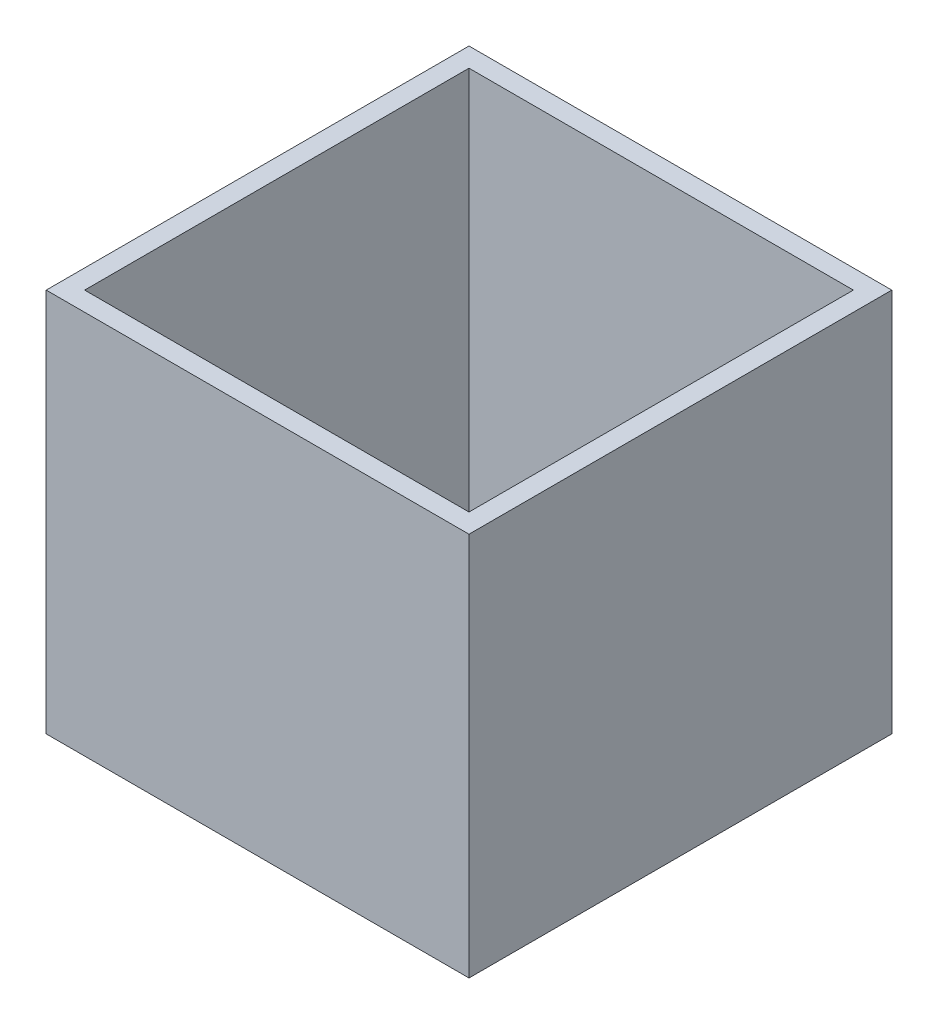
ISO-10303-21;
HEADER;
FILE_DESCRIPTION(('STEP AP214'),'2;1');
FILE_NAME('part.step','',(''),(''),'','','');
FILE_SCHEMA(('AUTOMOTIVE_DESIGN { 1 0 10303 214 1 1 1 1 }'));
ENDSEC;
DATA;
#1=APPLICATION_CONTEXT('core data for automotive mechanical design processes');
#2=APPLICATION_PROTOCOL_DEFINITION('international standard','automotive_design',2000,#1);
#3=PRODUCT_CONTEXT('',#1,'mechanical');
#4=PRODUCT('Part','Part','',(#3));
#5=PRODUCT_RELATED_PRODUCT_CATEGORY('part','',(#4));
#6=PRODUCT_DEFINITION_FORMATION('','',#4);
#7=PRODUCT_DEFINITION_CONTEXT('part definition',#1,'design');
#8=PRODUCT_DEFINITION('design','',#6,#7);
#9=PRODUCT_DEFINITION_SHAPE('','',#8);
#10=(LENGTH_UNIT() NAMED_UNIT(*) SI_UNIT(.MILLI.,.METRE.));
#11=(NAMED_UNIT(*) PLANE_ANGLE_UNIT() SI_UNIT($,.RADIAN.));
#12=(NAMED_UNIT(*) SI_UNIT($,.STERADIAN.) SOLID_ANGLE_UNIT());
#13=UNCERTAINTY_MEASURE_WITH_UNIT(LENGTH_MEASURE(1.E-05),#10,'distance_accuracy_value','');
#14=(GEOMETRIC_REPRESENTATION_CONTEXT(3) GLOBAL_UNCERTAINTY_ASSIGNED_CONTEXT((#13)) GLOBAL_UNIT_ASSIGNED_CONTEXT((#10,
#11,#12)) REPRESENTATION_CONTEXT('',''));
#15=CARTESIAN_POINT('',(0.,0.,0.));
#16=DIRECTION('',(0.,0.,1.));
#17=DIRECTION('',(1.,0.,0.));
#18=AXIS2_PLACEMENT_3D('',#15,#16,#17);
#19=CARTESIAN_POINT('',(41.91,76.2,-38.1));
#20=DIRECTION('',(-1.,0.,0.));
#21=DIRECTION('',(0.,0.,1.));
#22=AXIS2_PLACEMENT_3D('',#19,#20,#21);
#23=PLANE('',#22);
#24=DIRECTION('',(0.,0.,-1.));
#25=VECTOR('',#24,1.);
#26=CARTESIAN_POINT('',(41.91,0.,-38.1));
#27=LINE('',#26,#25);
#28=CARTESIAN_POINT('',(41.91,0.,41.91));
#29=VERTEX_POINT('',#28);
#30=CARTESIAN_POINT('',(41.91,0.,-41.91));
#31=VERTEX_POINT('',#30);
#32=EDGE_CURVE('E119',#29,#31,#27,.T.);
#33=ORIENTED_EDGE('',*,*,#32,.T.);
#34=DIRECTION('',(0.,-1.,0.));
#35=VECTOR('',#34,1.);
#36=CARTESIAN_POINT('',(41.91,76.2,-41.91));
#37=LINE('',#36,#35);
#38=CARTESIAN_POINT('',(41.91,76.2,-41.91));
#39=VERTEX_POINT('',#38);
#40=EDGE_CURVE('E11',#39,#31,#37,.T.);
#41=ORIENTED_EDGE('',*,*,#40,.F.);
#42=DIRECTION('',(0.,0.,-1.));
#43=VECTOR('',#42,1.);
#44=CARTESIAN_POINT('',(41.91,76.2,-38.1));
#45=LINE('',#44,#43);
#46=CARTESIAN_POINT('',(41.91,76.2,41.91));
#47=VERTEX_POINT('',#46);
#48=EDGE_CURVE('E153',#47,#39,#45,.T.);
#49=ORIENTED_EDGE('',*,*,#48,.F.);
#50=DIRECTION('',(0.,-1.,0.));
#51=VECTOR('',#50,1.);
#52=CARTESIAN_POINT('',(41.91,76.2,41.91));
#53=LINE('',#52,#51);
#54=EDGE_CURVE('E140',#47,#29,#53,.T.);
#55=ORIENTED_EDGE('',*,*,#54,.T.);
#56=EDGE_LOOP('',(#33,#41,#49,#55));
#57=FACE_BOUND('',#56,.T.);
#58=ADVANCED_FACE('F33',(#57),#23,.F.);
#59=CARTESIAN_POINT('',(-38.1,76.2,-41.91));
#60=DIRECTION('',(0.,0.,1.));
#61=DIRECTION('',(1.,0.,0.));
#62=AXIS2_PLACEMENT_3D('',#59,#60,#61);
#63=PLANE('',#62);
#64=DIRECTION('',(-1.,0.,0.));
#65=VECTOR('',#64,1.);
#66=CARTESIAN_POINT('',(-38.1,0.,-41.91));
#67=LINE('',#66,#65);
#68=CARTESIAN_POINT('',(-41.91,0.,-41.91));
#69=VERTEX_POINT('',#68);
#70=EDGE_CURVE('E150',#31,#69,#67,.T.);
#71=ORIENTED_EDGE('',*,*,#70,.T.);
#72=DIRECTION('',(0.,-1.,0.));
#73=VECTOR('',#72,1.);
#74=CARTESIAN_POINT('',(-41.91,76.2,-41.91));
#75=LINE('',#74,#73);
#76=CARTESIAN_POINT('',(-41.91,76.2,-41.91));
#77=VERTEX_POINT('',#76);
#78=EDGE_CURVE('E42',#77,#69,#75,.T.);
#79=ORIENTED_EDGE('',*,*,#78,.F.);
#80=DIRECTION('',(-1.,0.,0.));
#81=VECTOR('',#80,1.);
#82=CARTESIAN_POINT('',(-38.1,76.2,-41.91));
#83=LINE('',#82,#81);
#84=EDGE_CURVE('E159',#39,#77,#83,.T.);
#85=ORIENTED_EDGE('',*,*,#84,.F.);
#86=ORIENTED_EDGE('',*,*,#40,.T.);
#87=EDGE_LOOP('',(#71,#79,#85,#86));
#88=FACE_BOUND('',#87,.T.);
#89=ADVANCED_FACE('F172',(#88),#63,.F.);
#90=CARTESIAN_POINT('',(-41.91,76.2,-38.1));
#91=DIRECTION('',(1.,0.,0.));
#92=DIRECTION('',(0.,0.,-1.));
#93=AXIS2_PLACEMENT_3D('',#90,#91,#92);
#94=PLANE('',#93);
#95=DIRECTION('',(0.,0.,1.));
#96=VECTOR('',#95,1.);
#97=CARTESIAN_POINT('',(-41.91,0.,-38.1));
#98=LINE('',#97,#96);
#99=CARTESIAN_POINT('',(-41.91,0.,41.91));
#100=VERTEX_POINT('',#99);
#101=EDGE_CURVE('E154',#69,#100,#98,.T.);
#102=ORIENTED_EDGE('',*,*,#101,.T.);
#103=DIRECTION('',(0.,-1.,0.));
#104=VECTOR('',#103,1.);
#105=CARTESIAN_POINT('',(-41.91,76.2,41.91));
#106=LINE('',#105,#104);
#107=CARTESIAN_POINT('',(-41.91,76.2,41.91));
#108=VERTEX_POINT('',#107);
#109=EDGE_CURVE('E143',#108,#100,#106,.T.);
#110=ORIENTED_EDGE('',*,*,#109,.F.);
#111=DIRECTION('',(0.,0.,1.));
#112=VECTOR('',#111,1.);
#113=CARTESIAN_POINT('',(-41.91,76.2,-38.1));
#114=LINE('',#113,#112);
#115=EDGE_CURVE('E160',#77,#108,#114,.T.);
#116=ORIENTED_EDGE('',*,*,#115,.F.);
#117=ORIENTED_EDGE('',*,*,#78,.T.);
#118=EDGE_LOOP('',(#102,#110,#116,#117));
#119=FACE_BOUND('',#118,.T.);
#120=ADVANCED_FACE('F176',(#119),#94,.F.);
#121=CARTESIAN_POINT('',(-38.1,76.2,41.91));
#122=DIRECTION('',(0.,0.,-1.));
#123=DIRECTION('',(-1.,0.,0.));
#124=AXIS2_PLACEMENT_3D('',#121,#122,#123);
#125=PLANE('',#124);
#126=DIRECTION('',(1.,0.,0.));
#127=VECTOR('',#126,1.);
#128=CARTESIAN_POINT('',(-38.1,0.,41.91));
#129=LINE('',#128,#127);
#130=EDGE_CURVE('E151',#100,#29,#129,.T.);
#131=ORIENTED_EDGE('',*,*,#130,.T.);
#132=ORIENTED_EDGE('',*,*,#54,.F.);
#133=DIRECTION('',(1.,0.,0.));
#134=VECTOR('',#133,1.);
#135=CARTESIAN_POINT('',(-38.1,76.2,41.91));
#136=LINE('',#135,#134);
#137=EDGE_CURVE('E37',#108,#47,#136,.T.);
#138=ORIENTED_EDGE('',*,*,#137,.F.);
#139=ORIENTED_EDGE('',*,*,#109,.T.);
#140=EDGE_LOOP('',(#131,#132,#138,#139));
#141=FACE_BOUND('',#140,.T.);
#142=ADVANCED_FACE('F35',(#141),#125,.F.);
#143=CARTESIAN_POINT('',(0.,76.2,0.));
#144=DIRECTION('',(0.,1.,0.));
#145=DIRECTION('',(0.,0.,1.));
#146=AXIS2_PLACEMENT_3D('',#143,#144,#145);
#147=PLANE('',#146);
#148=DIRECTION('',(0.,0.,-1.));
#149=VECTOR('',#148,1.);
#150=CARTESIAN_POINT('',(38.1,76.2,-38.1));
#151=LINE('',#150,#149);
#152=CARTESIAN_POINT('',(38.1,76.2,38.1));
#153=VERTEX_POINT('',#152);
#154=CARTESIAN_POINT('',(38.1,76.2,-38.1));
#155=VERTEX_POINT('',#154);
#156=EDGE_CURVE('E102',#153,#155,#151,.T.);
#157=ORIENTED_EDGE('',*,*,#156,.F.);
#158=DIRECTION('',(1.,0.,0.));
#159=VECTOR('',#158,1.);
#160=CARTESIAN_POINT('',(-38.1,76.2,38.1));
#161=LINE('',#160,#159);
#162=CARTESIAN_POINT('',(-38.1,76.2,38.1));
#163=VERTEX_POINT('',#162);
#164=EDGE_CURVE('E127',#163,#153,#161,.T.);
#165=ORIENTED_EDGE('',*,*,#164,.F.);
#166=DIRECTION('',(0.,0.,1.));
#167=VECTOR('',#166,1.);
#168=CARTESIAN_POINT('',(-38.1,76.2,-38.1));
#169=LINE('',#168,#167);
#170=CARTESIAN_POINT('',(-38.1,76.2,-38.1));
#171=VERTEX_POINT('',#170);
#172=EDGE_CURVE('E125',#171,#163,#169,.T.);
#173=ORIENTED_EDGE('',*,*,#172,.F.);
#174=DIRECTION('',(-1.,0.,0.));
#175=VECTOR('',#174,1.);
#176=CARTESIAN_POINT('',(-38.1,76.2,-38.1));
#177=LINE('',#176,#175);
#178=EDGE_CURVE('E112',#155,#171,#177,.T.);
#179=ORIENTED_EDGE('',*,*,#178,.F.);
#180=EDGE_LOOP('',(#157,#165,#173,#179));
#181=FACE_BOUND('',#180,.T.);
#182=ORIENTED_EDGE('',*,*,#48,.T.);
#183=ORIENTED_EDGE('',*,*,#84,.T.);
#184=ORIENTED_EDGE('',*,*,#115,.T.);
#185=ORIENTED_EDGE('',*,*,#137,.T.);
#186=EDGE_LOOP('',(#182,#183,#184,#185));
#187=FACE_BOUND('',#186,.T.);
#188=ADVANCED_FACE('F123',(#181,#187),#147,.T.);
#189=CARTESIAN_POINT('',(0.,0.,0.));
#190=DIRECTION('',(0.,1.,0.));
#191=DIRECTION('',(0.,0.,1.));
#192=AXIS2_PLACEMENT_3D('',#189,#190,#191);
#193=PLANE('',#192);
#194=DIRECTION('',(1.,0.,0.));
#195=VECTOR('',#194,1.);
#196=CARTESIAN_POINT('',(-38.1,0.,38.1));
#197=LINE('',#196,#195);
#198=CARTESIAN_POINT('',(-38.1,0.,38.1));
#199=VERTEX_POINT('',#198);
#200=CARTESIAN_POINT('',(38.1,0.,38.1));
#201=VERTEX_POINT('',#200);
#202=EDGE_CURVE('E113',#199,#201,#197,.T.);
#203=ORIENTED_EDGE('',*,*,#202,.T.);
#204=DIRECTION('',(0.,0.,-1.));
#205=VECTOR('',#204,1.);
#206=CARTESIAN_POINT('',(38.1,0.,-38.1));
#207=LINE('',#206,#205);
#208=CARTESIAN_POINT('',(38.1,0.,-38.1));
#209=VERTEX_POINT('',#208);
#210=EDGE_CURVE('E131',#201,#209,#207,.T.);
#211=ORIENTED_EDGE('',*,*,#210,.T.);
#212=DIRECTION('',(-1.,0.,0.));
#213=VECTOR('',#212,1.);
#214=CARTESIAN_POINT('',(-38.1,0.,-38.1));
#215=LINE('',#214,#213);
#216=CARTESIAN_POINT('',(-38.1,0.,-38.1));
#217=VERTEX_POINT('',#216);
#218=EDGE_CURVE('E118',#209,#217,#215,.T.);
#219=ORIENTED_EDGE('',*,*,#218,.T.);
#220=DIRECTION('',(0.,0.,1.));
#221=VECTOR('',#220,1.);
#222=CARTESIAN_POINT('',(-38.1,0.,-38.1));
#223=LINE('',#222,#221);
#224=EDGE_CURVE('E57',#217,#199,#223,.T.);
#225=ORIENTED_EDGE('',*,*,#224,.T.);
#226=EDGE_LOOP('',(#203,#211,#219,#225));
#227=FACE_BOUND('',#226,.T.);
#228=ORIENTED_EDGE('',*,*,#32,.F.);
#229=ORIENTED_EDGE('',*,*,#130,.F.);
#230=ORIENTED_EDGE('',*,*,#101,.F.);
#231=ORIENTED_EDGE('',*,*,#70,.F.);
#232=EDGE_LOOP('',(#228,#229,#230,#231));
#233=FACE_BOUND('',#232,.T.);
#234=ADVANCED_FACE('F178',(#227,#233),#193,.F.);
#235=CARTESIAN_POINT('',(38.1,76.2,-38.1));
#236=DIRECTION('',(-1.,0.,0.));
#237=DIRECTION('',(0.,0.,1.));
#238=AXIS2_PLACEMENT_3D('',#235,#236,#237);
#239=PLANE('',#238);
#240=ORIENTED_EDGE('',*,*,#210,.F.);
#241=DIRECTION('',(0.,-1.,0.));
#242=VECTOR('',#241,1.);
#243=CARTESIAN_POINT('',(38.1,76.2,38.1));
#244=LINE('',#243,#242);
#245=EDGE_CURVE('E108',#153,#201,#244,.T.);
#246=ORIENTED_EDGE('',*,*,#245,.F.);
#247=ORIENTED_EDGE('',*,*,#156,.T.);
#248=DIRECTION('',(0.,-1.,0.));
#249=VECTOR('',#248,1.);
#250=CARTESIAN_POINT('',(38.1,76.2,-38.1));
#251=LINE('',#250,#249);
#252=EDGE_CURVE('E106',#155,#209,#251,.T.);
#253=ORIENTED_EDGE('',*,*,#252,.T.);
#254=EDGE_LOOP('',(#240,#246,#247,#253));
#255=FACE_BOUND('',#254,.T.);
#256=ADVANCED_FACE('F105',(#255),#239,.T.);
#257=CARTESIAN_POINT('',(-38.1,76.2,-38.1));
#258=DIRECTION('',(0.,0.,1.));
#259=DIRECTION('',(1.,0.,0.));
#260=AXIS2_PLACEMENT_3D('',#257,#258,#259);
#261=PLANE('',#260);
#262=ORIENTED_EDGE('',*,*,#218,.F.);
#263=ORIENTED_EDGE('',*,*,#252,.F.);
#264=ORIENTED_EDGE('',*,*,#178,.T.);
#265=DIRECTION('',(0.,-1.,0.));
#266=VECTOR('',#265,1.);
#267=CARTESIAN_POINT('',(-38.1,76.2,-38.1));
#268=LINE('',#267,#266);
#269=EDGE_CURVE('E120',#171,#217,#268,.T.);
#270=ORIENTED_EDGE('',*,*,#269,.T.);
#271=EDGE_LOOP('',(#262,#263,#264,#270));
#272=FACE_BOUND('',#271,.T.);
#273=ADVANCED_FACE('F116',(#272),#261,.T.);
#274=CARTESIAN_POINT('',(-38.1,76.2,-38.1));
#275=DIRECTION('',(1.,0.,0.));
#276=DIRECTION('',(0.,0.,-1.));
#277=AXIS2_PLACEMENT_3D('',#274,#275,#276);
#278=PLANE('',#277);
#279=ORIENTED_EDGE('',*,*,#224,.F.);
#280=ORIENTED_EDGE('',*,*,#269,.F.);
#281=ORIENTED_EDGE('',*,*,#172,.T.);
#282=DIRECTION('',(0.,-1.,0.));
#283=VECTOR('',#282,1.);
#284=CARTESIAN_POINT('',(-38.1,76.2,38.1));
#285=LINE('',#284,#283);
#286=EDGE_CURVE('E50',#163,#199,#285,.T.);
#287=ORIENTED_EDGE('',*,*,#286,.T.);
#288=EDGE_LOOP('',(#279,#280,#281,#287));
#289=FACE_BOUND('',#288,.T.);
#290=ADVANCED_FACE('F223',(#289),#278,.T.);
#291=CARTESIAN_POINT('',(-38.1,76.2,38.1));
#292=DIRECTION('',(0.,0.,-1.));
#293=DIRECTION('',(-1.,0.,0.));
#294=AXIS2_PLACEMENT_3D('',#291,#292,#293);
#295=PLANE('',#294);
#296=ORIENTED_EDGE('',*,*,#202,.F.);
#297=ORIENTED_EDGE('',*,*,#286,.F.);
#298=ORIENTED_EDGE('',*,*,#164,.T.);
#299=ORIENTED_EDGE('',*,*,#245,.T.);
#300=EDGE_LOOP('',(#296,#297,#298,#299));
#301=FACE_BOUND('',#300,.T.);
#302=ADVANCED_FACE('F232',(#301),#295,.T.);
#303=CLOSED_SHELL('',(#58,#89,#120,#142,#188,#234,#256,#273,#290,#302));
#304=MANIFOLD_SOLID_BREP('B2',#303);
#305=ADVANCED_BREP_SHAPE_REPRESENTATION('',(#18,#304),#14);
#306=SHAPE_DEFINITION_REPRESENTATION(#9,#305);
ENDSEC;
END-ISO-10303-21;
